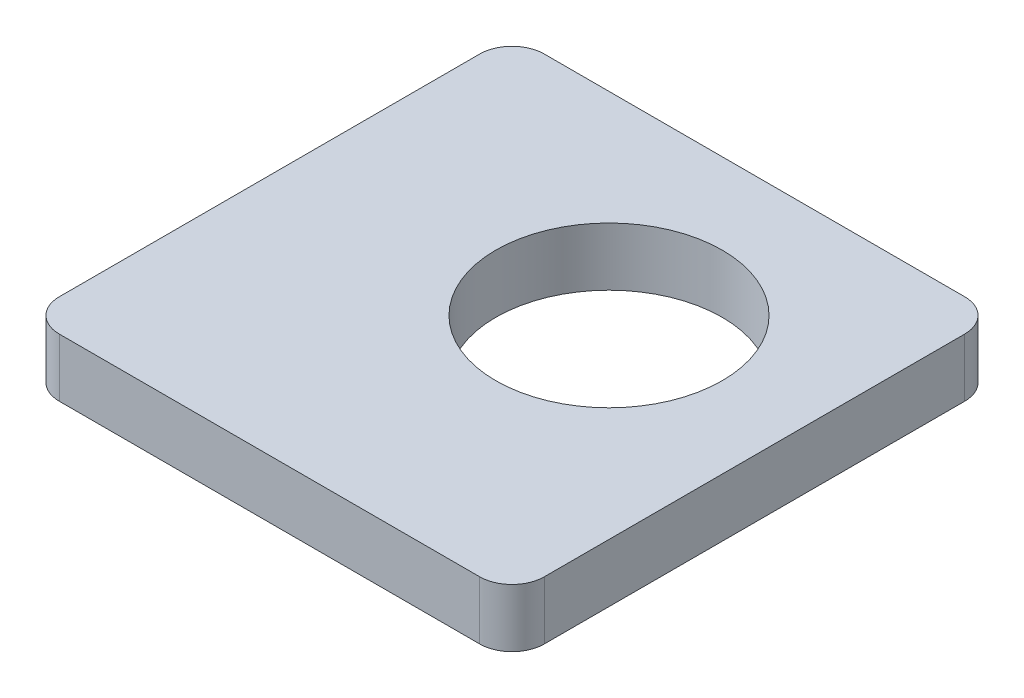
ISO-10303-21;
HEADER;
FILE_DESCRIPTION(('STEP AP214'),'2;1');
FILE_NAME('part.step','',(''),(''),'','','');
FILE_SCHEMA(('AUTOMOTIVE_DESIGN { 1 0 10303 214 1 1 1 1 }'));
ENDSEC;
DATA;
#1=APPLICATION_CONTEXT('core data for automotive mechanical design processes');
#2=APPLICATION_PROTOCOL_DEFINITION('international standard','automotive_design',2000,#1);
#3=PRODUCT_CONTEXT('',#1,'mechanical');
#4=PRODUCT('Part','Part','',(#3));
#5=PRODUCT_RELATED_PRODUCT_CATEGORY('part','',(#4));
#6=PRODUCT_DEFINITION_FORMATION('','',#4);
#7=PRODUCT_DEFINITION_CONTEXT('part definition',#1,'design');
#8=PRODUCT_DEFINITION('design','',#6,#7);
#9=PRODUCT_DEFINITION_SHAPE('','',#8);
#10=(LENGTH_UNIT() NAMED_UNIT(*) SI_UNIT(.MILLI.,.METRE.));
#11=(NAMED_UNIT(*) PLANE_ANGLE_UNIT() SI_UNIT($,.RADIAN.));
#12=(NAMED_UNIT(*) SI_UNIT($,.STERADIAN.) SOLID_ANGLE_UNIT());
#13=UNCERTAINTY_MEASURE_WITH_UNIT(LENGTH_MEASURE(1.E-05),#10,'distance_accuracy_value','');
#14=(GEOMETRIC_REPRESENTATION_CONTEXT(3) GLOBAL_UNCERTAINTY_ASSIGNED_CONTEXT((#13)) GLOBAL_UNIT_ASSIGNED_CONTEXT((#10,
#11,#12)) REPRESENTATION_CONTEXT('',''));
#15=CARTESIAN_POINT('',(0.,0.,0.));
#16=DIRECTION('',(0.,0.,1.));
#17=DIRECTION('',(1.,0.,0.));
#18=AXIS2_PLACEMENT_3D('',#15,#16,#17);
#19=CARTESIAN_POINT('',(0.,18.,0.));
#20=DIRECTION('',(0.,-1.,0.));
#21=DIRECTION('',(0.,0.,-1.));
#22=AXIS2_PLACEMENT_3D('',#19,#20,#21);
#23=PLANE('',#22);
#24=DIRECTION('',(-1.,0.,0.));
#25=VECTOR('',#24,1.);
#26=CARTESIAN_POINT('',(-75.,18.,-75.));
#27=LINE('',#26,#25);
#28=CARTESIAN_POINT('',(65.,18.,-75.));
#29=VERTEX_POINT('',#28);
#30=CARTESIAN_POINT('',(-65.,18.,-75.));
#31=VERTEX_POINT('',#30);
#32=EDGE_CURVE('E140',#29,#31,#27,.T.);
#33=ORIENTED_EDGE('',*,*,#32,.T.);
#34=CARTESIAN_POINT('',(-65.,18.,-65.));
#35=DIRECTION('',(0.,-1.,0.));
#36=DIRECTION('',(0.,0.,-1.));
#37=AXIS2_PLACEMENT_3D('',#34,#35,#36);
#38=CIRCLE('',#37,10.);
#39=CARTESIAN_POINT('',(-75.,18.,-65.));
#40=VERTEX_POINT('',#39);
#41=EDGE_CURVE('E159',#31,#40,#38,.F.);
#42=ORIENTED_EDGE('',*,*,#41,.T.);
#43=DIRECTION('',(0.,0.,1.));
#44=VECTOR('',#43,1.);
#45=CARTESIAN_POINT('',(-75.,18.,75.));
#46=LINE('',#45,#44);
#47=CARTESIAN_POINT('',(-75.,18.,65.));
#48=VERTEX_POINT('',#47);
#49=EDGE_CURVE('E123',#40,#48,#46,.T.);
#50=ORIENTED_EDGE('',*,*,#49,.T.);
#51=CARTESIAN_POINT('',(-65.,18.,65.));
#52=DIRECTION('',(0.,-1.,0.));
#53=DIRECTION('',(0.,0.,-1.));
#54=AXIS2_PLACEMENT_3D('',#51,#52,#53);
#55=CIRCLE('',#54,10.);
#56=CARTESIAN_POINT('',(-65.,18.,75.));
#57=VERTEX_POINT('',#56);
#58=EDGE_CURVE('E154',#48,#57,#55,.F.);
#59=ORIENTED_EDGE('',*,*,#58,.T.);
#60=DIRECTION('',(1.,0.,0.));
#61=VECTOR('',#60,1.);
#62=CARTESIAN_POINT('',(-75.,18.,75.));
#63=LINE('',#62,#61);
#64=CARTESIAN_POINT('',(65.,18.,75.));
#65=VERTEX_POINT('',#64);
#66=EDGE_CURVE('E170',#57,#65,#63,.T.);
#67=ORIENTED_EDGE('',*,*,#66,.T.);
#68=CARTESIAN_POINT('',(65.,18.,65.));
#69=DIRECTION('',(0.,-1.,0.));
#70=DIRECTION('',(0.,0.,-1.));
#71=AXIS2_PLACEMENT_3D('',#68,#69,#70);
#72=CIRCLE('',#71,10.);
#73=CARTESIAN_POINT('',(75.,18.,65.));
#74=VERTEX_POINT('',#73);
#75=EDGE_CURVE('E59',#65,#74,#72,.F.);
#76=ORIENTED_EDGE('',*,*,#75,.T.);
#77=DIRECTION('',(0.,0.,-1.));
#78=VECTOR('',#77,1.);
#79=CARTESIAN_POINT('',(75.,18.,75.));
#80=LINE('',#79,#78);
#81=CARTESIAN_POINT('',(75.,18.,-65.));
#82=VERTEX_POINT('',#81);
#83=EDGE_CURVE('E178',#74,#82,#80,.T.);
#84=ORIENTED_EDGE('',*,*,#83,.T.);
#85=CARTESIAN_POINT('',(65.,18.,-65.));
#86=DIRECTION('',(0.,-1.,0.));
#87=DIRECTION('',(0.,0.,-1.));
#88=AXIS2_PLACEMENT_3D('',#85,#86,#87);
#89=CIRCLE('',#88,10.);
#90=EDGE_CURVE('E157',#82,#29,#89,.F.);
#91=ORIENTED_EDGE('',*,*,#90,.T.);
#92=EDGE_LOOP('',(#33,#42,#50,#59,#67,#76,#84,#91));
#93=FACE_BOUND('',#92,.T.);
#94=CARTESIAN_POINT('',(15.,18.,-15.));
#95=DIRECTION('',(0.,1.,0.));
#96=DIRECTION('',(0.,0.,1.));
#97=AXIS2_PLACEMENT_3D('',#94,#95,#96);
#98=CIRCLE('',#97,35.);
#99=CARTESIAN_POINT('',(15.,18.,20.));
#100=VERTEX_POINT('',#99);
#101=EDGE_CURVE('E131',#100,#100,#98,.T.);
#102=ORIENTED_EDGE('',*,*,#101,.F.);
#103=EDGE_LOOP('',(#102));
#104=FACE_BOUND('',#103,.T.);
#105=ADVANCED_FACE('F37',(#93,#104),#23,.F.);
#106=CARTESIAN_POINT('',(0.,0.,0.));
#107=DIRECTION('',(0.,-1.,0.));
#108=DIRECTION('',(0.,0.,-1.));
#109=AXIS2_PLACEMENT_3D('',#106,#107,#108);
#110=PLANE('',#109);
#111=DIRECTION('',(0.,0.,1.));
#112=VECTOR('',#111,1.);
#113=CARTESIAN_POINT('',(-75.,0.,75.));
#114=LINE('',#113,#112);
#115=CARTESIAN_POINT('',(-75.,0.,-65.));
#116=VERTEX_POINT('',#115);
#117=CARTESIAN_POINT('',(-75.,0.,65.));
#118=VERTEX_POINT('',#117);
#119=EDGE_CURVE('E120',#116,#118,#114,.T.);
#120=ORIENTED_EDGE('',*,*,#119,.F.);
#121=CARTESIAN_POINT('',(-65.,0.,-65.));
#122=DIRECTION('',(0.,-1.,0.));
#123=DIRECTION('',(0.,0.,-1.));
#124=AXIS2_PLACEMENT_3D('',#121,#122,#123);
#125=CIRCLE('',#124,10.);
#126=CARTESIAN_POINT('',(-65.,0.,-75.));
#127=VERTEX_POINT('',#126);
#128=EDGE_CURVE('E103',#116,#127,#125,.T.);
#129=ORIENTED_EDGE('',*,*,#128,.T.);
#130=DIRECTION('',(-1.,0.,0.));
#131=VECTOR('',#130,1.);
#132=CARTESIAN_POINT('',(-75.,0.,-75.));
#133=LINE('',#132,#131);
#134=CARTESIAN_POINT('',(65.,0.,-75.));
#135=VERTEX_POINT('',#134);
#136=EDGE_CURVE('E144',#135,#127,#133,.T.);
#137=ORIENTED_EDGE('',*,*,#136,.F.);
#138=CARTESIAN_POINT('',(65.,0.,-65.));
#139=DIRECTION('',(0.,-1.,0.));
#140=DIRECTION('',(0.,0.,-1.));
#141=AXIS2_PLACEMENT_3D('',#138,#139,#140);
#142=CIRCLE('',#141,10.);
#143=CARTESIAN_POINT('',(75.,0.,-65.));
#144=VERTEX_POINT('',#143);
#145=EDGE_CURVE('E114',#135,#144,#142,.T.);
#146=ORIENTED_EDGE('',*,*,#145,.T.);
#147=DIRECTION('',(0.,0.,-1.));
#148=VECTOR('',#147,1.);
#149=CARTESIAN_POINT('',(75.,0.,75.));
#150=LINE('',#149,#148);
#151=CARTESIAN_POINT('',(75.,0.,65.));
#152=VERTEX_POINT('',#151);
#153=EDGE_CURVE('E134',#152,#144,#150,.T.);
#154=ORIENTED_EDGE('',*,*,#153,.F.);
#155=CARTESIAN_POINT('',(65.,0.,65.));
#156=DIRECTION('',(0.,-1.,0.));
#157=DIRECTION('',(0.,0.,-1.));
#158=AXIS2_PLACEMENT_3D('',#155,#156,#157);
#159=CIRCLE('',#158,10.);
#160=CARTESIAN_POINT('',(65.,0.,75.));
#161=VERTEX_POINT('',#160);
#162=EDGE_CURVE('E148',#152,#161,#159,.T.);
#163=ORIENTED_EDGE('',*,*,#162,.T.);
#164=DIRECTION('',(1.,0.,0.));
#165=VECTOR('',#164,1.);
#166=CARTESIAN_POINT('',(-75.,0.,75.));
#167=LINE('',#166,#165);
#168=CARTESIAN_POINT('',(-65.,0.,75.));
#169=VERTEX_POINT('',#168);
#170=EDGE_CURVE('E130',#169,#161,#167,.T.);
#171=ORIENTED_EDGE('',*,*,#170,.F.);
#172=CARTESIAN_POINT('',(-65.,0.,65.));
#173=DIRECTION('',(0.,-1.,0.));
#174=DIRECTION('',(0.,0.,-1.));
#175=AXIS2_PLACEMENT_3D('',#172,#173,#174);
#176=CIRCLE('',#175,10.);
#177=EDGE_CURVE('E124',#169,#118,#176,.T.);
#178=ORIENTED_EDGE('',*,*,#177,.T.);
#179=EDGE_LOOP('',(#120,#129,#137,#146,#154,#163,#171,#178));
#180=FACE_BOUND('',#179,.T.);
#181=CARTESIAN_POINT('',(15.,0.,-15.));
#182=DIRECTION('',(0.,1.,0.));
#183=DIRECTION('',(0.,0.,1.));
#184=AXIS2_PLACEMENT_3D('',#181,#182,#183);
#185=CIRCLE('',#184,35.);
#186=CARTESIAN_POINT('',(15.,0.,20.));
#187=VERTEX_POINT('',#186);
#188=EDGE_CURVE('E137',#187,#187,#185,.T.);
#189=ORIENTED_EDGE('',*,*,#188,.T.);
#190=EDGE_LOOP('',(#189));
#191=FACE_BOUND('',#190,.T.);
#192=ADVANCED_FACE('F127',(#180,#191),#110,.T.);
#193=CARTESIAN_POINT('',(-75.,18.,75.));
#194=DIRECTION('',(1.,0.,0.));
#195=DIRECTION('',(0.,0.,-1.));
#196=AXIS2_PLACEMENT_3D('',#193,#194,#195);
#197=PLANE('',#196);
#198=ORIENTED_EDGE('',*,*,#49,.F.);
#199=DIRECTION('',(0.,-1.,0.));
#200=VECTOR('',#199,1.);
#201=CARTESIAN_POINT('',(-75.,18.,-65.));
#202=LINE('',#201,#200);
#203=EDGE_CURVE('E107',#40,#116,#202,.T.);
#204=ORIENTED_EDGE('',*,*,#203,.T.);
#205=ORIENTED_EDGE('',*,*,#119,.T.);
#206=DIRECTION('',(0.,-1.,0.));
#207=VECTOR('',#206,1.);
#208=CARTESIAN_POINT('',(-75.,18.,65.));
#209=LINE('',#208,#207);
#210=EDGE_CURVE('E125',#118,#48,#209,.F.);
#211=ORIENTED_EDGE('',*,*,#210,.T.);
#212=EDGE_LOOP('',(#198,#204,#205,#211));
#213=FACE_BOUND('',#212,.T.);
#214=ADVANCED_FACE('F119',(#213),#197,.F.);
#215=CARTESIAN_POINT('',(-75.,18.,75.));
#216=DIRECTION('',(0.,0.,-1.));
#217=DIRECTION('',(-1.,0.,0.));
#218=AXIS2_PLACEMENT_3D('',#215,#216,#217);
#219=PLANE('',#218);
#220=ORIENTED_EDGE('',*,*,#170,.T.);
#221=DIRECTION('',(0.,-1.,0.));
#222=VECTOR('',#221,1.);
#223=CARTESIAN_POINT('',(65.,18.,75.));
#224=LINE('',#223,#222);
#225=EDGE_CURVE('E11',#161,#65,#224,.F.);
#226=ORIENTED_EDGE('',*,*,#225,.T.);
#227=ORIENTED_EDGE('',*,*,#66,.F.);
#228=DIRECTION('',(0.,-1.,0.));
#229=VECTOR('',#228,1.);
#230=CARTESIAN_POINT('',(-65.,18.,75.));
#231=LINE('',#230,#229);
#232=EDGE_CURVE('E45',#57,#169,#231,.T.);
#233=ORIENTED_EDGE('',*,*,#232,.T.);
#234=EDGE_LOOP('',(#220,#226,#227,#233));
#235=FACE_BOUND('',#234,.T.);
#236=ADVANCED_FACE('F168',(#235),#219,.F.);
#237=CARTESIAN_POINT('',(75.,18.,75.));
#238=DIRECTION('',(-1.,0.,0.));
#239=DIRECTION('',(0.,0.,1.));
#240=AXIS2_PLACEMENT_3D('',#237,#238,#239);
#241=PLANE('',#240);
#242=ORIENTED_EDGE('',*,*,#153,.T.);
#243=DIRECTION('',(0.,-1.,0.));
#244=VECTOR('',#243,1.);
#245=CARTESIAN_POINT('',(75.,18.,-65.));
#246=LINE('',#245,#244);
#247=EDGE_CURVE('E52',#144,#82,#246,.F.);
#248=ORIENTED_EDGE('',*,*,#247,.T.);
#249=ORIENTED_EDGE('',*,*,#83,.F.);
#250=DIRECTION('',(0.,-1.,0.));
#251=VECTOR('',#250,1.);
#252=CARTESIAN_POINT('',(75.,18.,65.));
#253=LINE('',#252,#251);
#254=EDGE_CURVE('E161',#74,#152,#253,.T.);
#255=ORIENTED_EDGE('',*,*,#254,.T.);
#256=EDGE_LOOP('',(#242,#248,#249,#255));
#257=FACE_BOUND('',#256,.T.);
#258=ADVANCED_FACE('F177',(#257),#241,.F.);
#259=CARTESIAN_POINT('',(-75.,18.,-75.));
#260=DIRECTION('',(0.,0.,1.));
#261=DIRECTION('',(1.,0.,0.));
#262=AXIS2_PLACEMENT_3D('',#259,#260,#261);
#263=PLANE('',#262);
#264=ORIENTED_EDGE('',*,*,#136,.T.);
#265=DIRECTION('',(0.,-1.,0.));
#266=VECTOR('',#265,1.);
#267=CARTESIAN_POINT('',(-65.,18.,-75.));
#268=LINE('',#267,#266);
#269=EDGE_CURVE('E108',#127,#31,#268,.F.);
#270=ORIENTED_EDGE('',*,*,#269,.T.);
#271=ORIENTED_EDGE('',*,*,#32,.F.);
#272=DIRECTION('',(0.,-1.,0.));
#273=VECTOR('',#272,1.);
#274=CARTESIAN_POINT('',(65.,18.,-75.));
#275=LINE('',#274,#273);
#276=EDGE_CURVE('E113',#29,#135,#275,.T.);
#277=ORIENTED_EDGE('',*,*,#276,.T.);
#278=EDGE_LOOP('',(#264,#270,#271,#277));
#279=FACE_BOUND('',#278,.T.);
#280=ADVANCED_FACE('F189',(#279),#263,.F.);
#281=CARTESIAN_POINT('',(15.,18.,-15.));
#282=DIRECTION('',(0.,-1.,0.));
#283=DIRECTION('',(0.,0.,-1.));
#284=AXIS2_PLACEMENT_3D('',#281,#282,#283);
#285=CYLINDRICAL_SURFACE('',#284,35.);
#286=ORIENTED_EDGE('',*,*,#101,.T.);
#287=EDGE_LOOP('',(#286));
#288=FACE_BOUND('',#287,.T.);
#289=ORIENTED_EDGE('',*,*,#188,.F.);
#290=EDGE_LOOP('',(#289));
#291=FACE_BOUND('',#290,.T.);
#292=ADVANCED_FACE('F187',(#288,#291),#285,.F.);
#293=CARTESIAN_POINT('',(-65.,18.,-65.));
#294=DIRECTION('',(0.,-1.,0.));
#295=DIRECTION('',(0.,0.,-1.));
#296=AXIS2_PLACEMENT_3D('',#293,#294,#295);
#297=CYLINDRICAL_SURFACE('',#296,10.);
#298=ORIENTED_EDGE('',*,*,#41,.F.);
#299=ORIENTED_EDGE('',*,*,#269,.F.);
#300=ORIENTED_EDGE('',*,*,#128,.F.);
#301=ORIENTED_EDGE('',*,*,#203,.F.);
#302=EDGE_LOOP('',(#298,#299,#300,#301));
#303=FACE_BOUND('',#302,.T.);
#304=ADVANCED_FACE('F106',(#303),#297,.T.);
#305=CARTESIAN_POINT('',(65.,18.,-65.));
#306=DIRECTION('',(0.,-1.,0.));
#307=DIRECTION('',(0.,0.,-1.));
#308=AXIS2_PLACEMENT_3D('',#305,#306,#307);
#309=CYLINDRICAL_SURFACE('',#308,10.);
#310=ORIENTED_EDGE('',*,*,#90,.F.);
#311=ORIENTED_EDGE('',*,*,#247,.F.);
#312=ORIENTED_EDGE('',*,*,#145,.F.);
#313=ORIENTED_EDGE('',*,*,#276,.F.);
#314=EDGE_LOOP('',(#310,#311,#312,#313));
#315=FACE_BOUND('',#314,.T.);
#316=ADVANCED_FACE('F196',(#315),#309,.T.);
#317=CARTESIAN_POINT('',(65.,18.,65.));
#318=DIRECTION('',(0.,-1.,0.));
#319=DIRECTION('',(0.,0.,-1.));
#320=AXIS2_PLACEMENT_3D('',#317,#318,#319);
#321=CYLINDRICAL_SURFACE('',#320,10.);
#322=ORIENTED_EDGE('',*,*,#75,.F.);
#323=ORIENTED_EDGE('',*,*,#225,.F.);
#324=ORIENTED_EDGE('',*,*,#162,.F.);
#325=ORIENTED_EDGE('',*,*,#254,.F.);
#326=EDGE_LOOP('',(#322,#323,#324,#325));
#327=FACE_BOUND('',#326,.T.);
#328=ADVANCED_FACE('F176',(#327),#321,.T.);
#329=CARTESIAN_POINT('',(-65.,18.,65.));
#330=DIRECTION('',(0.,-1.,0.));
#331=DIRECTION('',(0.,0.,-1.));
#332=AXIS2_PLACEMENT_3D('',#329,#330,#331);
#333=CYLINDRICAL_SURFACE('',#332,10.);
#334=ORIENTED_EDGE('',*,*,#58,.F.);
#335=ORIENTED_EDGE('',*,*,#210,.F.);
#336=ORIENTED_EDGE('',*,*,#177,.F.);
#337=ORIENTED_EDGE('',*,*,#232,.F.);
#338=EDGE_LOOP('',(#334,#335,#336,#337));
#339=FACE_BOUND('',#338,.T.);
#340=ADVANCED_FACE('F39',(#339),#333,.T.);
#341=CLOSED_SHELL('',(#105,#192,#214,#236,#258,#280,#292,#304,#316,#328,#340));
#342=MANIFOLD_SOLID_BREP('B2',#341);
#343=ADVANCED_BREP_SHAPE_REPRESENTATION('',(#18,#342),#14);
#344=SHAPE_DEFINITION_REPRESENTATION(#9,#343);
ENDSEC;
END-ISO-10303-21;
